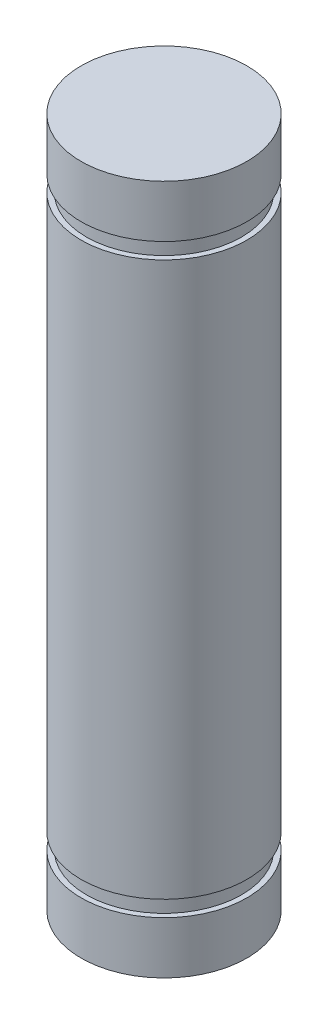
ISO-10303-21;
HEADER;
FILE_DESCRIPTION(('STEP AP214'),'2;1');
FILE_NAME('part.step','',(''),(''),'','','');
FILE_SCHEMA(('AUTOMOTIVE_DESIGN { 1 0 10303 214 1 1 1 1 }'));
ENDSEC;
DATA;
#1=APPLICATION_CONTEXT('core data for automotive mechanical design processes');
#2=APPLICATION_PROTOCOL_DEFINITION('international standard','automotive_design',2000,#1);
#3=PRODUCT_CONTEXT('',#1,'mechanical');
#4=PRODUCT('Part','Part','',(#3));
#5=PRODUCT_RELATED_PRODUCT_CATEGORY('part','',(#4));
#6=PRODUCT_DEFINITION_FORMATION('','',#4);
#7=PRODUCT_DEFINITION_CONTEXT('part definition',#1,'design');
#8=PRODUCT_DEFINITION('design','',#6,#7);
#9=PRODUCT_DEFINITION_SHAPE('','',#8);
#10=(LENGTH_UNIT() NAMED_UNIT(*) SI_UNIT(.MILLI.,.METRE.));
#11=(NAMED_UNIT(*) PLANE_ANGLE_UNIT() SI_UNIT($,.RADIAN.));
#12=(NAMED_UNIT(*) SI_UNIT($,.STERADIAN.) SOLID_ANGLE_UNIT());
#13=UNCERTAINTY_MEASURE_WITH_UNIT(LENGTH_MEASURE(1.E-05),#10,'distance_accuracy_value','');
#14=(GEOMETRIC_REPRESENTATION_CONTEXT(3) GLOBAL_UNCERTAINTY_ASSIGNED_CONTEXT((#13)) GLOBAL_UNIT_ASSIGNED_CONTEXT((#10,
#11,#12)) REPRESENTATION_CONTEXT('',''));
#15=CARTESIAN_POINT('',(0.,0.,0.));
#16=DIRECTION('',(0.,0.,1.));
#17=DIRECTION('',(1.,0.,0.));
#18=AXIS2_PLACEMENT_3D('',#15,#16,#17);
#19=CARTESIAN_POINT('',(16.,-51.604,0.));
#20=DIRECTION('',(0.,-1.,0.));
#21=DIRECTION('',(1.,0.,0.));
#22=AXIS2_PLACEMENT_3D('',#19,#20,#21);
#23=PLANE('',#22);
#24=CARTESIAN_POINT('',(32.,-51.604,0.));
#25=DIRECTION('',(0.,-1.,0.));
#26=DIRECTION('',(0.,0.,-1.));
#27=AXIS2_PLACEMENT_3D('',#24,#25,#26);
#28=CIRCLE('',#27,1.4859);
#29=CARTESIAN_POINT('',(32.,-51.604,-1.4859));
#30=VERTEX_POINT('',#29);
#31=EDGE_CURVE('E10',#30,#30,#28,.T.);
#32=ORIENTED_EDGE('',*,*,#31,.F.);
#33=EDGE_LOOP('',(#32));
#34=FACE_BOUND('',#33,.T.);
#35=CARTESIAN_POINT('',(32.,-51.604,0.));
#36=DIRECTION('',(0.,-1.,0.));
#37=DIRECTION('',(0.,0.,-1.));
#38=AXIS2_PLACEMENT_3D('',#35,#36,#37);
#39=CIRCLE('',#38,1.5875);
#40=CARTESIAN_POINT('',(32.,-51.604,-1.5875));
#41=VERTEX_POINT('',#40);
#42=EDGE_CURVE('E19',#41,#41,#39,.F.);
#43=ORIENTED_EDGE('',*,*,#42,.F.);
#44=EDGE_LOOP('',(#43));
#45=FACE_BOUND('',#44,.T.);
#46=ADVANCED_FACE('F15',(#34,#45),#23,.T.);
#47=CARTESIAN_POINT('',(32.,-41.,0.));
#48=DIRECTION('',(0.,1.,0.));
#49=DIRECTION('',(-1.,0.,0.));
#50=AXIS2_PLACEMENT_3D('',#47,#48,#49);
#51=PLANE('',#50);
#52=CARTESIAN_POINT('',(32.,-41.,0.));
#53=DIRECTION('',(0.,-1.,0.));
#54=DIRECTION('',(0.,0.,-1.));
#55=AXIS2_PLACEMENT_3D('',#52,#53,#54);
#56=CIRCLE('',#55,1.4859);
#57=CARTESIAN_POINT('',(32.,-41.,-1.4859));
#58=VERTEX_POINT('',#57);
#59=EDGE_CURVE('E44',#58,#58,#56,.T.);
#60=ORIENTED_EDGE('',*,*,#59,.T.);
#61=EDGE_LOOP('',(#60));
#62=FACE_BOUND('',#61,.T.);
#63=CARTESIAN_POINT('',(32.,-41.,0.));
#64=DIRECTION('',(0.,1.,0.));
#65=DIRECTION('',(0.,0.,1.));
#66=AXIS2_PLACEMENT_3D('',#63,#64,#65);
#67=CIRCLE('',#66,1.5875);
#68=CARTESIAN_POINT('',(32.,-41.,1.5875));
#69=VERTEX_POINT('',#68);
#70=EDGE_CURVE('E24',#69,#69,#67,.T.);
#71=ORIENTED_EDGE('',*,*,#70,.T.);
#72=EDGE_LOOP('',(#71));
#73=FACE_BOUND('',#72,.T.);
#74=ADVANCED_FACE('F82',(#62,#73),#51,.T.);
#75=CARTESIAN_POINT('',(32.,-51.606,0.));
#76=DIRECTION('',(0.,1.,0.));
#77=DIRECTION('',(0.,0.,1.));
#78=AXIS2_PLACEMENT_3D('',#75,#76,#77);
#79=CYLINDRICAL_SURFACE('',#78,1.5875);
#80=ORIENTED_EDGE('',*,*,#70,.F.);
#81=EDGE_LOOP('',(#80));
#82=FACE_BOUND('',#81,.T.);
#83=ORIENTED_EDGE('',*,*,#42,.T.);
#84=EDGE_LOOP('',(#83));
#85=FACE_BOUND('',#84,.T.);
#86=ADVANCED_FACE('F17',(#82,#85),#79,.T.);
#87=CARTESIAN_POINT('',(32.,-51.9088,0.));
#88=DIRECTION('',(0.,1.,0.));
#89=DIRECTION('',(0.,0.,1.));
#90=AXIS2_PLACEMENT_3D('',#87,#88,#89);
#91=CYLINDRICAL_SURFACE('',#90,1.4859);
#92=CARTESIAN_POINT('',(32.,-51.9088,0.));
#93=DIRECTION('',(0.,-1.,0.));
#94=DIRECTION('',(0.,0.,-1.));
#95=AXIS2_PLACEMENT_3D('',#92,#93,#94);
#96=CIRCLE('',#95,1.4859);
#97=CARTESIAN_POINT('',(32.,-51.9088,-1.4859));
#98=VERTEX_POINT('',#97);
#99=EDGE_CURVE('E35',#98,#98,#96,.T.);
#100=ORIENTED_EDGE('',*,*,#99,.F.);
#101=EDGE_LOOP('',(#100));
#102=FACE_BOUND('',#101,.T.);
#103=ORIENTED_EDGE('',*,*,#31,.T.);
#104=EDGE_LOOP('',(#103));
#105=FACE_BOUND('',#104,.T.);
#106=ADVANCED_FACE('F90',(#102,#105),#91,.T.);
#107=CARTESIAN_POINT('',(32.,-52.9088,0.));
#108=DIRECTION('',(0.,1.,0.));
#109=DIRECTION('',(0.,0.,1.));
#110=AXIS2_PLACEMENT_3D('',#107,#108,#109);
#111=CYLINDRICAL_SURFACE('',#110,1.5875);
#112=CARTESIAN_POINT('',(32.,-52.9088,0.));
#113=DIRECTION('',(0.,-1.,0.));
#114=DIRECTION('',(0.,0.,-1.));
#115=AXIS2_PLACEMENT_3D('',#112,#113,#114);
#116=CIRCLE('',#115,1.5875);
#117=CARTESIAN_POINT('',(32.,-52.9088,-1.5875));
#118=VERTEX_POINT('',#117);
#119=EDGE_CURVE('E39',#118,#118,#116,.T.);
#120=ORIENTED_EDGE('',*,*,#119,.F.);
#121=EDGE_LOOP('',(#120));
#122=FACE_BOUND('',#121,.T.);
#123=CARTESIAN_POINT('',(32.,-51.9088,0.));
#124=DIRECTION('',(0.,-1.,0.));
#125=DIRECTION('',(0.,0.,-1.));
#126=AXIS2_PLACEMENT_3D('',#123,#124,#125);
#127=CIRCLE('',#126,1.5875);
#128=CARTESIAN_POINT('',(32.,-51.9088,-1.5875));
#129=VERTEX_POINT('',#128);
#130=EDGE_CURVE('E40',#129,#129,#127,.T.);
#131=ORIENTED_EDGE('',*,*,#130,.T.);
#132=EDGE_LOOP('',(#131));
#133=FACE_BOUND('',#132,.T.);
#134=ADVANCED_FACE('F97',(#122,#133),#111,.T.);
#135=CARTESIAN_POINT('',(32.,-52.9088,0.));
#136=DIRECTION('',(0.,-1.,0.));
#137=DIRECTION('',(1.,0.,0.));
#138=AXIS2_PLACEMENT_3D('',#135,#136,#137);
#139=PLANE('',#138);
#140=ORIENTED_EDGE('',*,*,#119,.T.);
#141=EDGE_LOOP('',(#140));
#142=FACE_BOUND('',#141,.T.);
#143=ADVANCED_FACE('F101',(#142),#139,.T.);
#144=CARTESIAN_POINT('',(32.,-51.9088,0.));
#145=DIRECTION('',(0.,-1.,0.));
#146=DIRECTION('',(1.,0.,0.));
#147=AXIS2_PLACEMENT_3D('',#144,#145,#146);
#148=PLANE('',#147);
#149=ORIENTED_EDGE('',*,*,#99,.T.);
#150=EDGE_LOOP('',(#149));
#151=FACE_BOUND('',#150,.T.);
#152=ORIENTED_EDGE('',*,*,#130,.F.);
#153=EDGE_LOOP('',(#152));
#154=FACE_BOUND('',#153,.T.);
#155=ADVANCED_FACE('F103',(#151,#154),#148,.F.);
#156=CARTESIAN_POINT('',(32.,-40.6952,0.));
#157=DIRECTION('',(0.,-1.,0.));
#158=DIRECTION('',(0.,0.,-1.));
#159=AXIS2_PLACEMENT_3D('',#156,#157,#158);
#160=CYLINDRICAL_SURFACE('',#159,1.4859);
#161=CARTESIAN_POINT('',(32.,-40.6952,0.));
#162=DIRECTION('',(0.,-1.,0.));
#163=DIRECTION('',(0.,0.,-1.));
#164=AXIS2_PLACEMENT_3D('',#161,#162,#163);
#165=CIRCLE('',#164,1.4859);
#166=CARTESIAN_POINT('',(32.,-40.6952,-1.4859));
#167=VERTEX_POINT('',#166);
#168=EDGE_CURVE('E51',#167,#167,#165,.T.);
#169=ORIENTED_EDGE('',*,*,#168,.T.);
#170=EDGE_LOOP('',(#169));
#171=FACE_BOUND('',#170,.T.);
#172=ORIENTED_EDGE('',*,*,#59,.F.);
#173=EDGE_LOOP('',(#172));
#174=FACE_BOUND('',#173,.T.);
#175=ADVANCED_FACE('F80',(#171,#174),#160,.T.);
#176=CARTESIAN_POINT('',(32.,-39.6952,0.));
#177=DIRECTION('',(0.,-1.,0.));
#178=DIRECTION('',(0.,0.,-1.));
#179=AXIS2_PLACEMENT_3D('',#176,#177,#178);
#180=CYLINDRICAL_SURFACE('',#179,1.5875);
#181=CARTESIAN_POINT('',(32.,-39.6952,0.));
#182=DIRECTION('',(0.,-1.,0.));
#183=DIRECTION('',(0.,0.,-1.));
#184=AXIS2_PLACEMENT_3D('',#181,#182,#183);
#185=CIRCLE('',#184,1.5875);
#186=CARTESIAN_POINT('',(32.,-39.6952,-1.5875));
#187=VERTEX_POINT('',#186);
#188=EDGE_CURVE('E55',#187,#187,#185,.T.);
#189=ORIENTED_EDGE('',*,*,#188,.T.);
#190=EDGE_LOOP('',(#189));
#191=FACE_BOUND('',#190,.T.);
#192=CARTESIAN_POINT('',(32.,-40.6952,0.));
#193=DIRECTION('',(0.,-1.,0.));
#194=DIRECTION('',(0.,0.,-1.));
#195=AXIS2_PLACEMENT_3D('',#192,#193,#194);
#196=CIRCLE('',#195,1.5875);
#197=CARTESIAN_POINT('',(32.,-40.6952,-1.5875));
#198=VERTEX_POINT('',#197);
#199=EDGE_CURVE('E56',#198,#198,#196,.T.);
#200=ORIENTED_EDGE('',*,*,#199,.F.);
#201=EDGE_LOOP('',(#200));
#202=FACE_BOUND('',#201,.T.);
#203=ADVANCED_FACE('F66',(#191,#202),#180,.T.);
#204=CARTESIAN_POINT('',(32.,-39.6952,0.));
#205=DIRECTION('',(0.,1.,0.));
#206=DIRECTION('',(1.,0.,0.));
#207=AXIS2_PLACEMENT_3D('',#204,#205,#206);
#208=PLANE('',#207);
#209=ORIENTED_EDGE('',*,*,#188,.F.);
#210=EDGE_LOOP('',(#209));
#211=FACE_BOUND('',#210,.T.);
#212=ADVANCED_FACE('F69',(#211),#208,.T.);
#213=CARTESIAN_POINT('',(32.,-40.6952,0.));
#214=DIRECTION('',(0.,1.,0.));
#215=DIRECTION('',(1.,0.,0.));
#216=AXIS2_PLACEMENT_3D('',#213,#214,#215);
#217=PLANE('',#216);
#218=ORIENTED_EDGE('',*,*,#168,.F.);
#219=EDGE_LOOP('',(#218));
#220=FACE_BOUND('',#219,.T.);
#221=ORIENTED_EDGE('',*,*,#199,.T.);
#222=EDGE_LOOP('',(#221));
#223=FACE_BOUND('',#222,.T.);
#224=ADVANCED_FACE('F71',(#220,#223),#217,.F.);
#225=CLOSED_SHELL('',(#46,#74,#86,#106,#134,#143,#155,#175,#203,#212,#224));
#226=MANIFOLD_SOLID_BREP('B1',#225);
#227=ADVANCED_BREP_SHAPE_REPRESENTATION('',(#18,#226),#14);
#228=SHAPE_DEFINITION_REPRESENTATION(#9,#227);
ENDSEC;
END-ISO-10303-21;
